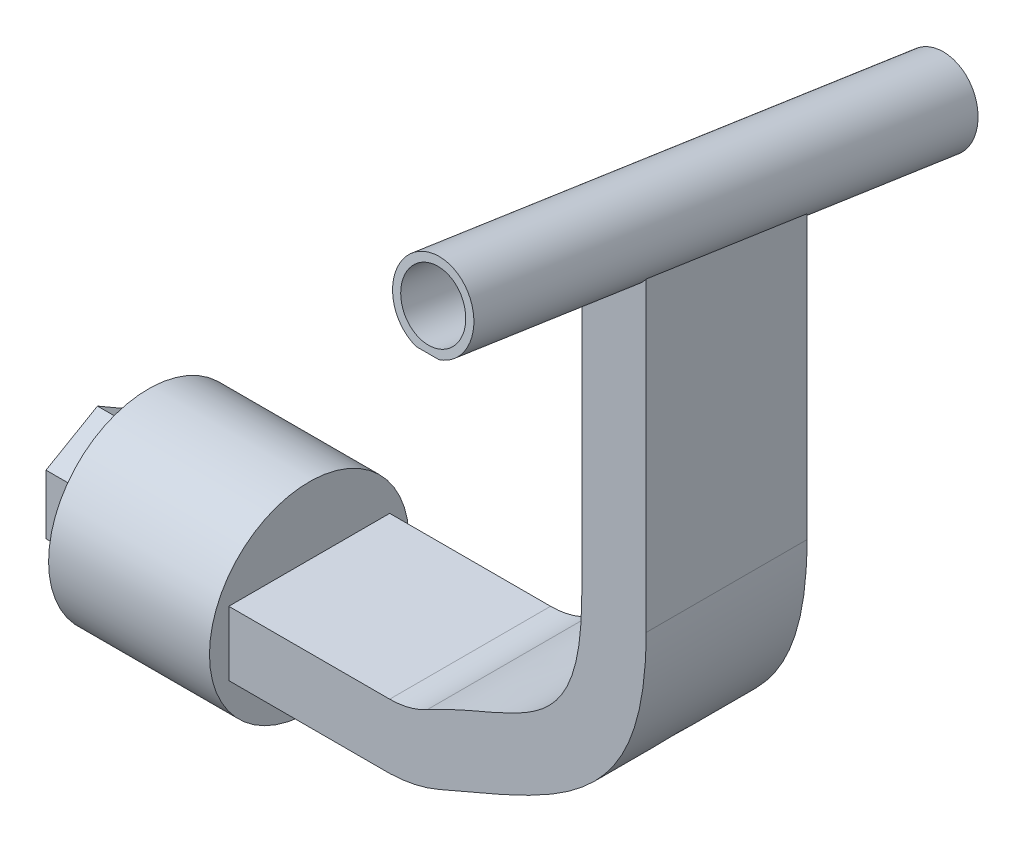
ISO-10303-21;
HEADER;
FILE_DESCRIPTION(('STEP AP214'),'2;1');
FILE_NAME('part.step','',(''),(''),'','','');
FILE_SCHEMA(('AUTOMOTIVE_DESIGN { 1 0 10303 214 1 1 1 1 }'));
ENDSEC;
DATA;
#1=APPLICATION_CONTEXT('core data for automotive mechanical design processes');
#2=APPLICATION_PROTOCOL_DEFINITION('international standard','automotive_design',2000,#1);
#3=PRODUCT_CONTEXT('',#1,'mechanical');
#4=PRODUCT('Part','Part','',(#3));
#5=PRODUCT_RELATED_PRODUCT_CATEGORY('part','',(#4));
#6=PRODUCT_DEFINITION_FORMATION('','',#4);
#7=PRODUCT_DEFINITION_CONTEXT('part definition',#1,'design');
#8=PRODUCT_DEFINITION('design','',#6,#7);
#9=PRODUCT_DEFINITION_SHAPE('','',#8);
#10=(LENGTH_UNIT() NAMED_UNIT(*) SI_UNIT(.MILLI.,.METRE.));
#11=(NAMED_UNIT(*) PLANE_ANGLE_UNIT() SI_UNIT($,.RADIAN.));
#12=(NAMED_UNIT(*) SI_UNIT($,.STERADIAN.) SOLID_ANGLE_UNIT());
#13=UNCERTAINTY_MEASURE_WITH_UNIT(LENGTH_MEASURE(1.E-05),#10,'distance_accuracy_value','');
#14=(GEOMETRIC_REPRESENTATION_CONTEXT(3) GLOBAL_UNCERTAINTY_ASSIGNED_CONTEXT((#13)) GLOBAL_UNIT_ASSIGNED_CONTEXT((#10,
#11,#12)) REPRESENTATION_CONTEXT('',''));
#15=CARTESIAN_POINT('',(0.,0.,0.));
#16=DIRECTION('',(0.,0.,1.));
#17=DIRECTION('',(1.,0.,0.));
#18=AXIS2_PLACEMENT_3D('',#15,#16,#17);
#19=CARTESIAN_POINT('',(303.883498747481,465.097462260105,173.034340632049));
#20=DIRECTION('',(0.,-0.146925308660243,-0.989147589429956));
#21=DIRECTION('',(0.,0.989147589429956,-0.146925308660243));
#22=AXIS2_PLACEMENT_3D('',#19,#20,#21);
#23=CYLINDRICAL_SURFACE('',#22,25.4);
#24=CARTESIAN_POINT('',(303.883498747481,479.428874282491,269.517933447575));
#25=DIRECTION('',(0.,-0.146925308660244,-0.989147589429956));
#26=DIRECTION('',(0.,0.989147589429956,-0.146925308660244));
#27=AXIS2_PLACEMENT_3D('',#24,#25,#26);
#28=CIRCLE('',#27,25.4);
#29=CARTESIAN_POINT('',(303.883498747481,504.553223054012,265.786030607604));
#30=VERTEX_POINT('',#29);
#31=EDGE_CURVE('E518',#30,#30,#28,.T.);
#32=ORIENTED_EDGE('',*,*,#31,.F.);
#33=EDGE_LOOP('',(#32));
#34=FACE_BOUND('',#33,.T.);
#35=CARTESIAN_POINT('',(303.883498747481,442.706045220284,22.2882480029235));
#36=DIRECTION('',(0.,-0.146925308660243,-0.989147589429956));
#37=DIRECTION('',(0.,0.989147589429956,-0.146925308660243));
#38=AXIS2_PLACEMENT_3D('',#35,#36,#37);
#39=CIRCLE('',#38,25.4);
#40=CARTESIAN_POINT('',(303.883498747481,467.830393991805,18.5563451629533));
#41=VERTEX_POINT('',#40);
#42=EDGE_CURVE('E11',#41,#41,#39,.F.);
#43=ORIENTED_EDGE('',*,*,#42,.F.);
#44=EDGE_LOOP('',(#43));
#45=FACE_BOUND('',#44,.T.);
#46=ADVANCED_FACE('F39',(#34,#45),#23,.F.);
#47=CARTESIAN_POINT('',(265.90949351965,390.165409654638,-123.979561218238));
#48=DIRECTION('',(0.,0.146925308660243,0.989147589429956));
#49=DIRECTION('',(0.,-0.989147589429956,0.146925308660243));
#50=AXIS2_PLACEMENT_3D('',#47,#48,#49);
#51=PLANE('',#50);
#52=CARTESIAN_POINT('',(303.883498747481,420.314628180463,-128.457844626202));
#53=DIRECTION('',(0.,-0.146925308660243,-0.989147589429956));
#54=DIRECTION('',(0.,0.989147589429956,-0.146925308660243));
#55=AXIS2_PLACEMENT_3D('',#52,#53,#54);
#56=CIRCLE('',#55,31.75);
#57=CARTESIAN_POINT('',(294.993498747482,390.165409654638,-123.979561218238));
#58=VERTEX_POINT('',#57);
#59=CARTESIAN_POINT('',(312.77349874748,390.165409654638,-123.979561218238));
#60=VERTEX_POINT('',#59);
#61=EDGE_CURVE('E179',#58,#60,#56,.T.);
#62=ORIENTED_EDGE('',*,*,#61,.T.);
#63=DIRECTION('',(1.,0.,0.));
#64=VECTOR('',#63,1.);
#65=CARTESIAN_POINT('',(265.90949351965,390.165409654638,-123.979561218238));
#66=LINE('',#65,#64);
#67=EDGE_CURVE('E195',#58,#60,#66,.T.);
#68=ORIENTED_EDGE('',*,*,#67,.F.);
#69=EDGE_LOOP('',(#62,#68));
#70=FACE_BOUND('',#69,.T.);
#71=ADVANCED_FACE('F202',(#70),#51,.F.);
#72=CARTESIAN_POINT('',(265.90949351965,390.165409654638,-123.979561218238));
#73=DIRECTION('',(0.,0.989147589429956,-0.146925308660243));
#74=DIRECTION('',(0.,0.146925308660243,0.989147589429956));
#75=AXIS2_PLACEMENT_3D('',#72,#73,#74);
#76=PLANE('',#75);
#77=DIRECTION('',(0.,-0.146925308660243,-0.989147589429956));
#78=VECTOR('',#77,1.);
#79=CARTESIAN_POINT('',(312.77349874748,450.892132371909,284.851918786842));
#80=LINE('',#79,#78);
#81=CARTESIAN_POINT('',(312.77349874748,449.279655756666,273.996216855539));
#82=VERTEX_POINT('',#81);
#83=CARTESIAN_POINT('',(312.77349874748,427.445235126035,127.));
#84=VERTEX_POINT('',#83);
#85=EDGE_CURVE('E213',#82,#84,#80,.T.);
#86=ORIENTED_EDGE('',*,*,#85,.F.);
#87=DIRECTION('',(1.,0.,0.));
#88=VECTOR('',#87,1.);
#89=CARTESIAN_POINT('',(265.90949351965,449.279655756666,273.996216855539));
#90=LINE('',#89,#88);
#91=CARTESIAN_POINT('',(294.993498747482,449.279655756666,273.996216855539));
#92=VERTEX_POINT('',#91);
#93=EDGE_CURVE('E205',#92,#82,#90,.T.);
#94=ORIENTED_EDGE('',*,*,#93,.F.);
#95=DIRECTION('',(0.,-0.146925308660243,-0.989147589429956));
#96=VECTOR('',#95,1.);
#97=CARTESIAN_POINT('',(294.993498747482,450.892132371909,284.851918786842));
#98=LINE('',#97,#96);
#99=CARTESIAN_POINT('',(294.993498747482,427.445235126035,127.));
#100=VERTEX_POINT('',#99);
#101=EDGE_CURVE('E200',#92,#100,#98,.T.);
#102=ORIENTED_EDGE('',*,*,#101,.T.);
#103=DIRECTION('',(-1.,0.,0.));
#104=VECTOR('',#103,1.);
#105=CARTESIAN_POINT('',(127.,427.445235126035,127.));
#106=LINE('',#105,#104);
#107=EDGE_CURVE('E204',#84,#100,#106,.T.);
#108=ORIENTED_EDGE('',*,*,#107,.F.);
#109=EDGE_LOOP('',(#86,#94,#102,#108));
#110=FACE_BOUND('',#109,.T.);
#111=ADVANCED_FACE('F334',(#110),#76,.F.);
#112=CARTESIAN_POINT('',(312.77349874748,408.580998485066,1.11022302462516E-13));
#113=VERTEX_POINT('',#112);
#114=EDGE_CURVE('E186',#113,#60,#80,.T.);
#115=ORIENTED_EDGE('',*,*,#114,.F.);
#116=DIRECTION('',(-1.,0.,0.));
#117=VECTOR('',#116,1.);
#118=CARTESIAN_POINT('',(127.,408.580998485066,0.));
#119=LINE('',#118,#117);
#120=CARTESIAN_POINT('',(294.993498747482,408.580998485066,1.11022302462516E-13));
#121=VERTEX_POINT('',#120);
#122=EDGE_CURVE('E197',#113,#121,#119,.T.);
#123=ORIENTED_EDGE('',*,*,#122,.T.);
#124=EDGE_CURVE('E183',#121,#58,#98,.T.);
#125=ORIENTED_EDGE('',*,*,#124,.T.);
#126=ORIENTED_EDGE('',*,*,#67,.T.);
#127=EDGE_LOOP('',(#115,#123,#125,#126));
#128=FACE_BOUND('',#127,.T.);
#129=ADVANCED_FACE('F194',(#128),#76,.F.);
#130=CARTESIAN_POINT('',(265.90949351965,449.279655756666,273.996216855539));
#131=DIRECTION('',(0.,-0.146925308660244,-0.989147589429956));
#132=DIRECTION('',(0.,0.989147589429956,-0.146925308660244));
#133=AXIS2_PLACEMENT_3D('',#130,#131,#132);
#134=PLANE('',#133);
#135=ORIENTED_EDGE('',*,*,#31,.T.);
#136=EDGE_LOOP('',(#135));
#137=FACE_BOUND('',#136,.T.);
#138=CARTESIAN_POINT('',(303.883498747481,479.428874282491,269.517933447575));
#139=DIRECTION('',(0.,-0.146925308660244,-0.989147589429956));
#140=DIRECTION('',(0.,0.989147589429956,-0.146925308660244));
#141=AXIS2_PLACEMENT_3D('',#138,#139,#140);
#142=CIRCLE('',#141,31.75);
#143=EDGE_CURVE('E48',#92,#82,#142,.T.);
#144=ORIENTED_EDGE('',*,*,#143,.F.);
#145=ORIENTED_EDGE('',*,*,#93,.T.);
#146=EDGE_LOOP('',(#144,#145));
#147=FACE_BOUND('',#146,.T.);
#148=ADVANCED_FACE('F344',(#137,#147),#134,.F.);
#149=CARTESIAN_POINT('',(329.40949351965,431.8,127.));
#150=DIRECTION('',(-1.,0.,0.));
#151=DIRECTION('',(0.,-1.,0.));
#152=AXIS2_PLACEMENT_3D('',#149,#150,#151);
#153=PLANE('',#152);
#154=DIRECTION('',(0.,1.,0.));
#155=VECTOR('',#154,1.);
#156=CARTESIAN_POINT('',(329.40949351965,431.8,0.));
#157=LINE('',#156,#155);
#158=CARTESIAN_POINT('',(329.40949351965,197.58169737665,0.));
#159=VERTEX_POINT('',#158);
#160=CARTESIAN_POINT('',(329.40949351965,420.307419163961,0.));
#161=VERTEX_POINT('',#160);
#162=EDGE_CURVE('E55',#159,#161,#157,.T.);
#163=ORIENTED_EDGE('',*,*,#162,.T.);
#164=DIRECTION('',(0.,-0.146925308660243,-0.989147589429956));
#165=VECTOR('',#164,1.);
#166=CARTESIAN_POINT('',(329.40949351965,462.365414264384,283.147708513865));
#167=LINE('',#166,#165);
#168=CARTESIAN_POINT('',(329.40949351965,439.17165580493,127.));
#169=VERTEX_POINT('',#168);
#170=EDGE_CURVE('E506',#169,#161,#167,.T.);
#171=ORIENTED_EDGE('',*,*,#170,.F.);
#172=DIRECTION('',(0.,1.,0.));
#173=VECTOR('',#172,1.);
#174=CARTESIAN_POINT('',(329.40949351965,431.8,127.));
#175=LINE('',#174,#173);
#176=CARTESIAN_POINT('',(329.40949351965,197.58169737665,127.));
#177=VERTEX_POINT('',#176);
#178=EDGE_CURVE('E63',#177,#169,#175,.T.);
#179=ORIENTED_EDGE('',*,*,#178,.F.);
#180=DIRECTION('',(0.,0.,-1.));
#181=VECTOR('',#180,1.);
#182=CARTESIAN_POINT('',(329.40949351965,197.58169737665,127.));
#183=LINE('',#182,#181);
#184=EDGE_CURVE('E476',#177,#159,#183,.T.);
#185=ORIENTED_EDGE('',*,*,#184,.T.);
#186=EDGE_LOOP('',(#163,#171,#179,#185));
#187=FACE_BOUND('',#186,.T.);
#188=ADVANCED_FACE('F319',(#187),#153,.F.);
#189=CARTESIAN_POINT('',(278.60949351965,197.58169737665,127.));
#190=DIRECTION('',(1.,0.,0.));
#191=DIRECTION('',(0.,0.,-1.));
#192=AXIS2_PLACEMENT_3D('',#189,#190,#191);
#193=PLANE('',#192);
#194=DIRECTION('',(0.,0.,-1.));
#195=VECTOR('',#194,1.);
#196=CARTESIAN_POINT('',(278.60949351965,197.58169737665,127.));
#197=LINE('',#196,#195);
#198=CARTESIAN_POINT('',(278.60949351965,197.58169737665,127.));
#199=VERTEX_POINT('',#198);
#200=CARTESIAN_POINT('',(278.60949351965,197.58169737665,0.));
#201=VERTEX_POINT('',#200);
#202=EDGE_CURVE('E472',#199,#201,#197,.T.);
#203=ORIENTED_EDGE('',*,*,#202,.F.);
#204=DIRECTION('',(0.,-1.,0.));
#205=VECTOR('',#204,1.);
#206=CARTESIAN_POINT('',(278.60949351965,197.58169737665,127.));
#207=LINE('',#206,#205);
#208=CARTESIAN_POINT('',(278.60949351965,438.831962842002,127.));
#209=VERTEX_POINT('',#208);
#210=EDGE_CURVE('E415',#209,#199,#207,.T.);
#211=ORIENTED_EDGE('',*,*,#210,.F.);
#212=DIRECTION('',(0.,-0.146925308660243,-0.989147589429956));
#213=VECTOR('',#212,1.);
#214=CARTESIAN_POINT('',(278.60949351965,462.033054269183,283.197076368978));
#215=LINE('',#214,#213);
#216=CARTESIAN_POINT('',(278.60949351965,419.967726201033,0.));
#217=VERTEX_POINT('',#216);
#218=EDGE_CURVE('E191',#209,#217,#215,.T.);
#219=ORIENTED_EDGE('',*,*,#218,.T.);
#220=DIRECTION('',(0.,-1.,0.));
#221=VECTOR('',#220,1.);
#222=CARTESIAN_POINT('',(278.60949351965,197.58169737665,0.));
#223=LINE('',#222,#221);
#224=EDGE_CURVE('E444',#217,#201,#223,.T.);
#225=ORIENTED_EDGE('',*,*,#224,.T.);
#226=EDGE_LOOP('',(#203,#211,#219,#225));
#227=FACE_BOUND('',#226,.T.);
#228=ADVANCED_FACE('F394',(#227),#193,.F.);
#229=CARTESIAN_POINT('',(127.,112.157410594799,127.));
#230=DIRECTION('',(0.,0.,1.));
#231=DIRECTION('',(1.,0.,0.));
#232=AXIS2_PLACEMENT_3D('',#229,#230,#231);
#233=PLANE('',#232);
#234=ORIENTED_EDGE('',*,*,#178,.T.);
#235=CARTESIAN_POINT('',(303.883498747481,458.259645761728,127.));
#236=DIRECTION('',(0.,0.,1.));
#237=DIRECTION('',(0.,-1.,0.));
#238=AXIS2_PLACEMENT_3D('',#235,#236,#237);
#239=ELLIPSE('',#238,32.0983444121797,31.75);
#240=EDGE_CURVE('E515',#169,#84,#239,.F.);
#241=ORIENTED_EDGE('',*,*,#240,.T.);
#242=ORIENTED_EDGE('',*,*,#107,.T.);
#243=EDGE_CURVE('E514',#100,#209,#239,.F.);
#244=ORIENTED_EDGE('',*,*,#243,.T.);
#245=ORIENTED_EDGE('',*,*,#210,.T.);
#246=CARTESIAN_POINT('',(278.60949351965,197.58169737665,127.));
#247=CARTESIAN_POINT('',(278.60949351965,141.969854777036,127.));
#248=CARTESIAN_POINT('',(253.765909659463,94.0189960509211,127.));
#249=CARTESIAN_POINT('',(189.028044030552,76.2956447531783,127.));
#250=CARTESIAN_POINT('',(156.630652755223,58.4288683458401,127.));
#251=B_SPLINE_CURVE_WITH_KNOTS('',3,(#246,#247,#248,#249,#250),.UNSPECIFIED.,.F.,.F.,(4,1,4),
(0.,0.524889868786519,1.),.UNSPECIFIED.);
#252=CARTESIAN_POINT('',(156.630652755223,58.4288683458401,127.));
#253=VERTEX_POINT('',#252);
#254=EDGE_CURVE('E408',#199,#253,#251,.T.);
#255=ORIENTED_EDGE('',*,*,#254,.T.);
#256=CARTESIAN_POINT('',(127.,112.157410594799,127.));
#257=DIRECTION('',(0.,0.,-1.));
#258=DIRECTION('',(1.,0.,0.));
#259=AXIS2_PLACEMENT_3D('',#256,#257,#258);
#260=CIRCLE('',#259,61.3574105947991);
#261=CARTESIAN_POINT('',(127.,50.8,127.));
#262=VERTEX_POINT('',#261);
#263=EDGE_CURVE('E414',#253,#262,#260,.T.);
#264=ORIENTED_EDGE('',*,*,#263,.T.);
#265=DIRECTION('',(-1.,0.,0.));
#266=VECTOR('',#265,1.);
#267=CARTESIAN_POINT('',(0.,50.8,127.));
#268=LINE('',#267,#266);
#269=CARTESIAN_POINT('',(0.,50.8,127.));
#270=VERTEX_POINT('',#269);
#271=EDGE_CURVE('E421',#262,#270,#268,.T.);
#272=ORIENTED_EDGE('',*,*,#271,.T.);
#273=DIRECTION('',(0.,-1.,0.));
#274=VECTOR('',#273,1.);
#275=CARTESIAN_POINT('',(0.,0.,127.));
#276=LINE('',#275,#274);
#277=CARTESIAN_POINT('',(0.,0.,127.));
#278=VERTEX_POINT('',#277);
#279=EDGE_CURVE('E291',#270,#278,#276,.T.);
#280=ORIENTED_EDGE('',*,*,#279,.T.);
#281=DIRECTION('',(1.,0.,0.));
#282=VECTOR('',#281,1.);
#283=CARTESIAN_POINT('',(0.,0.,127.));
#284=LINE('',#283,#282);
#285=CARTESIAN_POINT('',(127.,0.,127.));
#286=VERTEX_POINT('',#285);
#287=EDGE_CURVE('E295',#278,#286,#284,.T.);
#288=ORIENTED_EDGE('',*,*,#287,.T.);
#289=CARTESIAN_POINT('',(124.298891171521,105.453320242857,127.));
#290=DIRECTION('',(0.,0.,1.));
#291=DIRECTION('',(-1.,0.,0.));
#292=AXIS2_PLACEMENT_3D('',#289,#290,#291);
#293=CIRCLE('',#292,105.487908023365);
#294=CARTESIAN_POINT('',(165.763803889194,8.45662054404478,127.));
#295=VERTEX_POINT('',#294);
#296=EDGE_CURVE('E299',#286,#295,#293,.T.);
#297=ORIENTED_EDGE('',*,*,#296,.T.);
#298=CARTESIAN_POINT('',(165.763803889194,8.45662054404477,127.));
#299=CARTESIAN_POINT('',(215.950754250224,29.9109331417734,127.));
#300=CARTESIAN_POINT('',(293.749967936067,60.0247960495449,127.));
#301=CARTESIAN_POINT('',(329.40949351965,131.409080946919,127.));
#302=CARTESIAN_POINT('',(329.40949351965,197.58169737665,127.));
#303=B_SPLINE_CURVE_WITH_KNOTS('',3,(#298,#299,#300,#301,#302),.UNSPECIFIED.,.F.,.F.,(4,1,4),
(0.,0.489737157637003,1.),.UNSPECIFIED.);
#304=EDGE_CURVE('E302',#295,#177,#303,.T.);
#305=ORIENTED_EDGE('',*,*,#304,.T.);
#306=EDGE_LOOP('',(#234,#241,#242,#244,#245,#255,#264,#272,#280,#288,#297,#305));
#307=FACE_BOUND('',#306,.T.);
#308=ADVANCED_FACE('F391',(#307),#233,.T.);
#309=CARTESIAN_POINT('',(127.,112.157410594799,0.));
#310=DIRECTION('',(0.,0.,1.));
#311=DIRECTION('',(1.,0.,0.));
#312=AXIS2_PLACEMENT_3D('',#309,#310,#311);
#313=PLANE('',#312);
#314=CARTESIAN_POINT('',(278.60949351965,197.58169737665,0.));
#315=CARTESIAN_POINT('',(278.60949351965,141.969854777036,0.));
#316=CARTESIAN_POINT('',(253.765909659463,94.0189960509211,0.));
#317=CARTESIAN_POINT('',(189.028044030552,76.2956447531783,0.));
#318=CARTESIAN_POINT('',(156.630652755223,58.4288683458401,0.));
#319=B_SPLINE_CURVE_WITH_KNOTS('',3,(#314,#315,#316,#317,#318),.UNSPECIFIED.,.F.,.F.,(4,1,4),
(0.,0.524889868786519,1.),.UNSPECIFIED.);
#320=CARTESIAN_POINT('',(156.630652755223,58.4288683458401,0.));
#321=VERTEX_POINT('',#320);
#322=EDGE_CURVE('E447',#201,#321,#319,.T.);
#323=ORIENTED_EDGE('',*,*,#322,.F.);
#324=ORIENTED_EDGE('',*,*,#224,.F.);
#325=CARTESIAN_POINT('',(303.883498747481,439.395409120758,0.));
#326=DIRECTION('',(0.,0.,-1.));
#327=DIRECTION('',(0.,-1.,0.));
#328=AXIS2_PLACEMENT_3D('',#325,#326,#327);
#329=ELLIPSE('',#328,32.0983444121797,31.75);
#330=EDGE_CURVE('E509',#217,#121,#329,.F.);
#331=ORIENTED_EDGE('',*,*,#330,.T.);
#332=ORIENTED_EDGE('',*,*,#122,.F.);
#333=EDGE_CURVE('E510',#113,#161,#329,.F.);
#334=ORIENTED_EDGE('',*,*,#333,.T.);
#335=ORIENTED_EDGE('',*,*,#162,.F.);
#336=CARTESIAN_POINT('',(165.763803889194,8.45662054404477,0.));
#337=CARTESIAN_POINT('',(215.950754250224,29.9109331417734,0.));
#338=CARTESIAN_POINT('',(293.749967936067,60.0247960495449,0.));
#339=CARTESIAN_POINT('',(329.40949351965,131.409080946919,0.));
#340=CARTESIAN_POINT('',(329.40949351965,197.58169737665,0.));
#341=B_SPLINE_CURVE_WITH_KNOTS('',3,(#336,#337,#338,#339,#340),.UNSPECIFIED.,.F.,.F.,(4,1,4),
(0.,0.489737157637003,1.),.UNSPECIFIED.);
#342=CARTESIAN_POINT('',(165.763803889194,8.45662054404478,0.));
#343=VERTEX_POINT('',#342);
#344=EDGE_CURVE('E434',#343,#159,#341,.T.);
#345=ORIENTED_EDGE('',*,*,#344,.F.);
#346=CARTESIAN_POINT('',(124.298891171521,105.453320242857,0.));
#347=DIRECTION('',(0.,0.,1.));
#348=DIRECTION('',(-1.,0.,0.));
#349=AXIS2_PLACEMENT_3D('',#346,#347,#348);
#350=CIRCLE('',#349,105.487908023365);
#351=CARTESIAN_POINT('',(127.,0.,0.));
#352=VERTEX_POINT('',#351);
#353=EDGE_CURVE('E431',#352,#343,#350,.T.);
#354=ORIENTED_EDGE('',*,*,#353,.F.);
#355=DIRECTION('',(1.,0.,0.));
#356=VECTOR('',#355,1.);
#357=CARTESIAN_POINT('',(0.,0.,0.));
#358=LINE('',#357,#356);
#359=CARTESIAN_POINT('',(0.,0.,0.));
#360=VERTEX_POINT('',#359);
#361=EDGE_CURVE('E428',#360,#352,#358,.T.);
#362=ORIENTED_EDGE('',*,*,#361,.F.);
#363=DIRECTION('',(0.,-1.,0.));
#364=VECTOR('',#363,1.);
#365=CARTESIAN_POINT('',(0.,0.,0.));
#366=LINE('',#365,#364);
#367=CARTESIAN_POINT('',(0.,50.8,0.));
#368=VERTEX_POINT('',#367);
#369=EDGE_CURVE('E287',#368,#360,#366,.T.);
#370=ORIENTED_EDGE('',*,*,#369,.F.);
#371=DIRECTION('',(-1.,0.,0.));
#372=VECTOR('',#371,1.);
#373=CARTESIAN_POINT('',(0.,50.8,0.));
#374=LINE('',#373,#372);
#375=CARTESIAN_POINT('',(127.,50.8,0.));
#376=VERTEX_POINT('',#375);
#377=EDGE_CURVE('E296',#376,#368,#374,.T.);
#378=ORIENTED_EDGE('',*,*,#377,.F.);
#379=CARTESIAN_POINT('',(127.,112.157410594799,0.));
#380=DIRECTION('',(0.,0.,-1.));
#381=DIRECTION('',(1.,0.,0.));
#382=AXIS2_PLACEMENT_3D('',#379,#380,#381);
#383=CIRCLE('',#382,61.3574105947991);
#384=EDGE_CURVE('E452',#321,#376,#383,.T.);
#385=ORIENTED_EDGE('',*,*,#384,.F.);
#386=EDGE_LOOP('',(#323,#324,#331,#332,#334,#335,#345,#354,#362,#370,#378,#385));
#387=FACE_BOUND('',#386,.T.);
#388=ADVANCED_FACE('F326',(#387),#313,.F.);
#389=CARTESIAN_POINT('',(0.,0.,127.));
#390=DIRECTION('',(0.,1.,0.));
#391=DIRECTION('',(0.,0.,1.));
#392=AXIS2_PLACEMENT_3D('',#389,#390,#391);
#393=PLANE('',#392);
#394=ORIENTED_EDGE('',*,*,#361,.T.);
#395=DIRECTION('',(0.,0.,-1.));
#396=VECTOR('',#395,1.);
#397=CARTESIAN_POINT('',(127.,0.,127.));
#398=LINE('',#397,#396);
#399=EDGE_CURVE('E483',#286,#352,#398,.T.);
#400=ORIENTED_EDGE('',*,*,#399,.F.);
#401=ORIENTED_EDGE('',*,*,#287,.F.);
#402=DIRECTION('',(0.,0.,-1.));
#403=VECTOR('',#402,1.);
#404=CARTESIAN_POINT('',(0.,0.,127.));
#405=LINE('',#404,#403);
#406=EDGE_CURVE('E487',#278,#360,#405,.T.);
#407=ORIENTED_EDGE('',*,*,#406,.T.);
#408=EDGE_LOOP('',(#394,#400,#401,#407));
#409=FACE_BOUND('',#408,.T.);
#410=ADVANCED_FACE('F41',(#409),#393,.F.);
#411=CARTESIAN_POINT('',(124.298891171521,105.453320242857,127.));
#412=DIRECTION('',(0.,0.,-1.));
#413=DIRECTION('',(-1.,0.,0.));
#414=AXIS2_PLACEMENT_3D('',#411,#412,#413);
#415=CYLINDRICAL_SURFACE('',#414,105.487908023365);
#416=ORIENTED_EDGE('',*,*,#353,.T.);
#417=DIRECTION('',(0.,0.,-1.));
#418=VECTOR('',#417,1.);
#419=CARTESIAN_POINT('',(165.763803889194,8.45662054404478,127.));
#420=LINE('',#419,#418);
#421=EDGE_CURVE('E479',#295,#343,#420,.T.);
#422=ORIENTED_EDGE('',*,*,#421,.F.);
#423=ORIENTED_EDGE('',*,*,#296,.F.);
#424=ORIENTED_EDGE('',*,*,#399,.T.);
#425=EDGE_LOOP('',(#416,#422,#423,#424));
#426=FACE_BOUND('',#425,.T.);
#427=ADVANCED_FACE('F317',(#426),#415,.T.);
#428=DIRECTION('',(0.,0.,-1.));
#429=VECTOR('',#428,1.);
#430=SURFACE_OF_LINEAR_EXTRUSION('',#303,#429);
#431=ORIENTED_EDGE('',*,*,#344,.T.);
#432=ORIENTED_EDGE('',*,*,#184,.F.);
#433=ORIENTED_EDGE('',*,*,#304,.F.);
#434=ORIENTED_EDGE('',*,*,#421,.T.);
#435=EDGE_LOOP('',(#431,#432,#433,#434));
#436=FACE_BOUND('',#435,.T.);
#437=ADVANCED_FACE('F313',(#436),#430,.F.);
#438=DIRECTION('',(0.,0.,-1.));
#439=VECTOR('',#438,1.);
#440=SURFACE_OF_LINEAR_EXTRUSION('',#251,#439);
#441=ORIENTED_EDGE('',*,*,#322,.T.);
#442=DIRECTION('',(0.,0.,-1.));
#443=VECTOR('',#442,1.);
#444=CARTESIAN_POINT('',(156.630652755223,58.4288683458401,127.));
#445=LINE('',#444,#443);
#446=EDGE_CURVE('E468',#253,#321,#445,.T.);
#447=ORIENTED_EDGE('',*,*,#446,.F.);
#448=ORIENTED_EDGE('',*,*,#254,.F.);
#449=ORIENTED_EDGE('',*,*,#202,.T.);
#450=EDGE_LOOP('',(#441,#447,#448,#449));
#451=FACE_BOUND('',#450,.T.);
#452=ADVANCED_FACE('F316',(#451),#440,.F.);
#453=CARTESIAN_POINT('',(127.,112.157410594799,127.));
#454=DIRECTION('',(0.,0.,-1.));
#455=DIRECTION('',(-1.,0.,0.));
#456=AXIS2_PLACEMENT_3D('',#453,#454,#455);
#457=CYLINDRICAL_SURFACE('',#456,61.3574105947991);
#458=ORIENTED_EDGE('',*,*,#384,.T.);
#459=DIRECTION('',(0.,0.,-1.));
#460=VECTOR('',#459,1.);
#461=CARTESIAN_POINT('',(127.,50.8,127.));
#462=LINE('',#461,#460);
#463=EDGE_CURVE('E464',#262,#376,#462,.T.);
#464=ORIENTED_EDGE('',*,*,#463,.F.);
#465=ORIENTED_EDGE('',*,*,#263,.F.);
#466=ORIENTED_EDGE('',*,*,#446,.T.);
#467=EDGE_LOOP('',(#458,#464,#465,#466));
#468=FACE_BOUND('',#467,.T.);
#469=ADVANCED_FACE('F400',(#468),#457,.F.);
#470=CARTESIAN_POINT('',(0.,50.8,127.));
#471=DIRECTION('',(0.,-1.,0.));
#472=DIRECTION('',(1.,0.,0.));
#473=AXIS2_PLACEMENT_3D('',#470,#471,#472);
#474=PLANE('',#473);
#475=ORIENTED_EDGE('',*,*,#377,.T.);
#476=DIRECTION('',(0.,0.,-1.));
#477=VECTOR('',#476,1.);
#478=CARTESIAN_POINT('',(0.,50.8,127.));
#479=LINE('',#478,#477);
#480=EDGE_CURVE('E424',#270,#368,#479,.T.);
#481=ORIENTED_EDGE('',*,*,#480,.F.);
#482=ORIENTED_EDGE('',*,*,#271,.F.);
#483=ORIENTED_EDGE('',*,*,#463,.T.);
#484=EDGE_LOOP('',(#475,#481,#482,#483));
#485=FACE_BOUND('',#484,.T.);
#486=ADVANCED_FACE('F386',(#485),#474,.F.);
#487=CARTESIAN_POINT('',(0.,25.4,63.5));
#488=DIRECTION('',(-1.,0.,0.));
#489=DIRECTION('',(0.,0.,1.));
#490=AXIS2_PLACEMENT_3D('',#487,#488,#489);
#491=PLANE('',#490);
#492=CARTESIAN_POINT('',(0.,25.4,63.5));
#493=DIRECTION('',(-1.,0.,0.));
#494=DIRECTION('',(0.,0.,1.));
#495=AXIS2_PLACEMENT_3D('',#492,#493,#494);
#496=CIRCLE('',#495,78.74);
#497=CARTESIAN_POINT('',(0.,25.4,142.24));
#498=VERTEX_POINT('',#497);
#499=EDGE_CURVE('E282',#498,#498,#496,.T.);
#500=ORIENTED_EDGE('',*,*,#499,.F.);
#501=EDGE_LOOP('',(#500));
#502=FACE_BOUND('',#501,.T.);
#503=ORIENTED_EDGE('',*,*,#480,.T.);
#504=ORIENTED_EDGE('',*,*,#369,.T.);
#505=ORIENTED_EDGE('',*,*,#406,.F.);
#506=ORIENTED_EDGE('',*,*,#279,.F.);
#507=EDGE_LOOP('',(#503,#504,#505,#506));
#508=FACE_BOUND('',#507,.T.);
#509=ADVANCED_FACE('F383',(#502,#508),#491,.F.);
#510=CARTESIAN_POINT('',(-127.,25.4,63.5));
#511=DIRECTION('',(1.,0.,0.));
#512=DIRECTION('',(0.,0.,-1.));
#513=AXIS2_PLACEMENT_3D('',#510,#511,#512);
#514=CYLINDRICAL_SURFACE('',#513,78.74);
#515=CARTESIAN_POINT('',(-127.,25.4,63.5));
#516=DIRECTION('',(-1.,0.,0.));
#517=DIRECTION('',(0.,0.,1.));
#518=AXIS2_PLACEMENT_3D('',#515,#516,#517);
#519=CIRCLE('',#518,78.74);
#520=CARTESIAN_POINT('',(-127.,25.4,142.24));
#521=VERTEX_POINT('',#520);
#522=EDGE_CURVE('E283',#521,#521,#519,.T.);
#523=ORIENTED_EDGE('',*,*,#522,.F.);
#524=EDGE_LOOP('',(#523));
#525=FACE_BOUND('',#524,.T.);
#526=ORIENTED_EDGE('',*,*,#499,.T.);
#527=EDGE_LOOP('',(#526));
#528=FACE_BOUND('',#527,.T.);
#529=ADVANCED_FACE('F381',(#525,#528),#514,.T.);
#530=CARTESIAN_POINT('',(-127.,25.4,63.5));
#531=DIRECTION('',(-1.,0.,0.));
#532=DIRECTION('',(0.,0.,1.));
#533=AXIS2_PLACEMENT_3D('',#530,#531,#532);
#534=PLANE('',#533);
#535=DIRECTION('',(0.,0.5,-0.866025403784439));
#536=VECTOR('',#535,1.);
#537=CARTESIAN_POINT('',(-127.,48.8635149398664,104.14));
#538=LINE('',#537,#536);
#539=CARTESIAN_POINT('',(-127.,48.8635149398664,104.14));
#540=VERTEX_POINT('',#539);
#541=CARTESIAN_POINT('',(-127.,72.3270298797328,63.5));
#542=VERTEX_POINT('',#541);
#543=EDGE_CURVE('E210',#540,#542,#538,.T.);
#544=ORIENTED_EDGE('',*,*,#543,.F.);
#545=DIRECTION('',(0.,1.,0.));
#546=VECTOR('',#545,1.);
#547=CARTESIAN_POINT('',(-127.,1.93648506013358,104.14));
#548=LINE('',#547,#546);
#549=CARTESIAN_POINT('',(-127.,1.93648506013358,104.14));
#550=VERTEX_POINT('',#549);
#551=EDGE_CURVE('E221',#550,#540,#548,.T.);
#552=ORIENTED_EDGE('',*,*,#551,.F.);
#553=DIRECTION('',(0.,0.5,0.866025403784439));
#554=VECTOR('',#553,1.);
#555=CARTESIAN_POINT('',(-127.,-21.5270298797328,63.5));
#556=LINE('',#555,#554);
#557=CARTESIAN_POINT('',(-127.,-21.5270298797328,63.5));
#558=VERTEX_POINT('',#557);
#559=EDGE_CURVE('E252',#558,#550,#556,.T.);
#560=ORIENTED_EDGE('',*,*,#559,.F.);
#561=DIRECTION('',(0.,-0.5,0.866025403784439));
#562=VECTOR('',#561,1.);
#563=CARTESIAN_POINT('',(-127.,1.93648506013359,22.86));
#564=LINE('',#563,#562);
#565=CARTESIAN_POINT('',(-127.,1.93648506013359,22.86));
#566=VERTEX_POINT('',#565);
#567=EDGE_CURVE('E248',#566,#558,#564,.T.);
#568=ORIENTED_EDGE('',*,*,#567,.F.);
#569=DIRECTION('',(0.,-1.,0.));
#570=VECTOR('',#569,1.);
#571=CARTESIAN_POINT('',(-127.,48.8635149398664,22.86));
#572=LINE('',#571,#570);
#573=CARTESIAN_POINT('',(-127.,48.8635149398664,22.86));
#574=VERTEX_POINT('',#573);
#575=EDGE_CURVE('E244',#574,#566,#572,.T.);
#576=ORIENTED_EDGE('',*,*,#575,.F.);
#577=DIRECTION('',(0.,-0.5,-0.866025403784439));
#578=VECTOR('',#577,1.);
#579=CARTESIAN_POINT('',(-127.,72.3270298797328,63.5));
#580=LINE('',#579,#578);
#581=EDGE_CURVE('E240',#542,#574,#580,.T.);
#582=ORIENTED_EDGE('',*,*,#581,.F.);
#583=EDGE_LOOP('',(#544,#552,#560,#568,#576,#582));
#584=FACE_BOUND('',#583,.T.);
#585=ORIENTED_EDGE('',*,*,#522,.T.);
#586=EDGE_LOOP('',(#585));
#587=FACE_BOUND('',#586,.T.);
#588=ADVANCED_FACE('F377',(#584,#587),#534,.T.);
#589=CARTESIAN_POINT('',(-167.132,48.8635149398664,104.14));
#590=DIRECTION('',(0.,-0.866025403784439,-0.5));
#591=DIRECTION('',(0.,0.5,-0.866025403784439));
#592=AXIS2_PLACEMENT_3D('',#589,#590,#591);
#593=PLANE('',#592);
#594=ORIENTED_EDGE('',*,*,#543,.T.);
#595=DIRECTION('',(1.,0.,0.));
#596=VECTOR('',#595,1.);
#597=CARTESIAN_POINT('',(-167.132,72.3270298797328,63.5));
#598=LINE('',#597,#596);
#599=CARTESIAN_POINT('',(-167.132,72.3270298797328,63.5));
#600=VERTEX_POINT('',#599);
#601=EDGE_CURVE('E278',#600,#542,#598,.T.);
#602=ORIENTED_EDGE('',*,*,#601,.F.);
#603=DIRECTION('',(0.,0.5,-0.866025403784439));
#604=VECTOR('',#603,1.);
#605=CARTESIAN_POINT('',(-167.132,48.8635149398664,104.14));
#606=LINE('',#605,#604);
#607=CARTESIAN_POINT('',(-167.132,48.8635149398664,104.14));
#608=VERTEX_POINT('',#607);
#609=EDGE_CURVE('E216',#608,#600,#606,.T.);
#610=ORIENTED_EDGE('',*,*,#609,.F.);
#611=DIRECTION('',(1.,0.,0.));
#612=VECTOR('',#611,1.);
#613=CARTESIAN_POINT('',(-167.132,48.8635149398664,104.14));
#614=LINE('',#613,#612);
#615=EDGE_CURVE('E236',#608,#540,#614,.T.);
#616=ORIENTED_EDGE('',*,*,#615,.T.);
#617=EDGE_LOOP('',(#594,#602,#610,#616));
#618=FACE_BOUND('',#617,.T.);
#619=ADVANCED_FACE('F373',(#618),#593,.F.);
#620=CARTESIAN_POINT('',(-167.132,72.3270298797328,63.5));
#621=DIRECTION('',(0.,-0.866025403784439,0.5));
#622=DIRECTION('',(0.,-0.5,-0.866025403784439));
#623=AXIS2_PLACEMENT_3D('',#620,#621,#622);
#624=PLANE('',#623);
#625=ORIENTED_EDGE('',*,*,#581,.T.);
#626=DIRECTION('',(1.,0.,0.));
#627=VECTOR('',#626,1.);
#628=CARTESIAN_POINT('',(-167.132,48.8635149398664,22.86));
#629=LINE('',#628,#627);
#630=CARTESIAN_POINT('',(-167.132,48.8635149398664,22.86));
#631=VERTEX_POINT('',#630);
#632=EDGE_CURVE('E274',#631,#574,#629,.T.);
#633=ORIENTED_EDGE('',*,*,#632,.F.);
#634=DIRECTION('',(0.,-0.5,-0.866025403784439));
#635=VECTOR('',#634,1.);
#636=CARTESIAN_POINT('',(-167.132,72.3270298797328,63.5));
#637=LINE('',#636,#635);
#638=EDGE_CURVE('E220',#600,#631,#637,.T.);
#639=ORIENTED_EDGE('',*,*,#638,.F.);
#640=ORIENTED_EDGE('',*,*,#601,.T.);
#641=EDGE_LOOP('',(#625,#633,#639,#640));
#642=FACE_BOUND('',#641,.T.);
#643=ADVANCED_FACE('F369',(#642),#624,.F.);
#644=CARTESIAN_POINT('',(-167.132,48.8635149398664,22.86));
#645=DIRECTION('',(0.,0.,1.));
#646=DIRECTION('',(0.,-1.,0.));
#647=AXIS2_PLACEMENT_3D('',#644,#645,#646);
#648=PLANE('',#647);
#649=ORIENTED_EDGE('',*,*,#575,.T.);
#650=DIRECTION('',(1.,0.,0.));
#651=VECTOR('',#650,1.);
#652=CARTESIAN_POINT('',(-167.132,1.93648506013359,22.86));
#653=LINE('',#652,#651);
#654=CARTESIAN_POINT('',(-167.132,1.93648506013359,22.86));
#655=VERTEX_POINT('',#654);
#656=EDGE_CURVE('E270',#655,#566,#653,.T.);
#657=ORIENTED_EDGE('',*,*,#656,.F.);
#658=DIRECTION('',(0.,-1.,0.));
#659=VECTOR('',#658,1.);
#660=CARTESIAN_POINT('',(-167.132,48.8635149398664,22.86));
#661=LINE('',#660,#659);
#662=EDGE_CURVE('E224',#631,#655,#661,.T.);
#663=ORIENTED_EDGE('',*,*,#662,.F.);
#664=ORIENTED_EDGE('',*,*,#632,.T.);
#665=EDGE_LOOP('',(#649,#657,#663,#664));
#666=FACE_BOUND('',#665,.T.);
#667=ADVANCED_FACE('F365',(#666),#648,.F.);
#668=CARTESIAN_POINT('',(-167.132,1.93648506013359,22.86));
#669=DIRECTION('',(0.,0.866025403784439,0.5));
#670=DIRECTION('',(0.,-0.5,0.866025403784439));
#671=AXIS2_PLACEMENT_3D('',#668,#669,#670);
#672=PLANE('',#671);
#673=ORIENTED_EDGE('',*,*,#567,.T.);
#674=DIRECTION('',(1.,0.,0.));
#675=VECTOR('',#674,1.);
#676=CARTESIAN_POINT('',(-167.132,-21.5270298797328,63.5));
#677=LINE('',#676,#675);
#678=CARTESIAN_POINT('',(-167.132,-21.5270298797328,63.5));
#679=VERTEX_POINT('',#678);
#680=EDGE_CURVE('E266',#679,#558,#677,.T.);
#681=ORIENTED_EDGE('',*,*,#680,.F.);
#682=DIRECTION('',(0.,-0.5,0.866025403784439));
#683=VECTOR('',#682,1.);
#684=CARTESIAN_POINT('',(-167.132,1.93648506013359,22.86));
#685=LINE('',#684,#683);
#686=EDGE_CURVE('E227',#655,#679,#685,.T.);
#687=ORIENTED_EDGE('',*,*,#686,.F.);
#688=ORIENTED_EDGE('',*,*,#656,.T.);
#689=EDGE_LOOP('',(#673,#681,#687,#688));
#690=FACE_BOUND('',#689,.T.);
#691=ADVANCED_FACE('F361',(#690),#672,.F.);
#692=CARTESIAN_POINT('',(-167.132,-21.5270298797328,63.5));
#693=DIRECTION('',(0.,0.866025403784439,-0.5));
#694=DIRECTION('',(0.,0.5,0.866025403784439));
#695=AXIS2_PLACEMENT_3D('',#692,#693,#694);
#696=PLANE('',#695);
#697=ORIENTED_EDGE('',*,*,#559,.T.);
#698=DIRECTION('',(1.,0.,0.));
#699=VECTOR('',#698,1.);
#700=CARTESIAN_POINT('',(-167.132,1.93648506013358,104.14));
#701=LINE('',#700,#699);
#702=CARTESIAN_POINT('',(-167.132,1.93648506013358,104.14));
#703=VERTEX_POINT('',#702);
#704=EDGE_CURVE('E262',#703,#550,#701,.T.);
#705=ORIENTED_EDGE('',*,*,#704,.F.);
#706=DIRECTION('',(0.,0.5,0.866025403784439));
#707=VECTOR('',#706,1.);
#708=CARTESIAN_POINT('',(-167.132,-21.5270298797328,63.5));
#709=LINE('',#708,#707);
#710=EDGE_CURVE('E230',#679,#703,#709,.T.);
#711=ORIENTED_EDGE('',*,*,#710,.F.);
#712=ORIENTED_EDGE('',*,*,#680,.T.);
#713=EDGE_LOOP('',(#697,#705,#711,#712));
#714=FACE_BOUND('',#713,.T.);
#715=ADVANCED_FACE('F357',(#714),#696,.F.);
#716=CARTESIAN_POINT('',(-167.132,1.93648506013358,104.14));
#717=DIRECTION('',(0.,0.,-1.));
#718=DIRECTION('',(0.,1.,0.));
#719=AXIS2_PLACEMENT_3D('',#716,#717,#718);
#720=PLANE('',#719);
#721=ORIENTED_EDGE('',*,*,#551,.T.);
#722=ORIENTED_EDGE('',*,*,#615,.F.);
#723=DIRECTION('',(0.,1.,0.));
#724=VECTOR('',#723,1.);
#725=CARTESIAN_POINT('',(-167.132,1.93648506013358,104.14));
#726=LINE('',#725,#724);
#727=EDGE_CURVE('E233',#703,#608,#726,.T.);
#728=ORIENTED_EDGE('',*,*,#727,.F.);
#729=ORIENTED_EDGE('',*,*,#704,.T.);
#730=EDGE_LOOP('',(#721,#722,#728,#729));
#731=FACE_BOUND('',#730,.T.);
#732=ADVANCED_FACE('F353',(#731),#720,.F.);
#733=CARTESIAN_POINT('',(-167.132,0.,0.));
#734=DIRECTION('',(-1.,0.,0.));
#735=DIRECTION('',(0.,0.,1.));
#736=AXIS2_PLACEMENT_3D('',#733,#734,#735);
#737=PLANE('',#736);
#738=ORIENTED_EDGE('',*,*,#609,.T.);
#739=ORIENTED_EDGE('',*,*,#638,.T.);
#740=ORIENTED_EDGE('',*,*,#662,.T.);
#741=ORIENTED_EDGE('',*,*,#686,.T.);
#742=ORIENTED_EDGE('',*,*,#710,.T.);
#743=ORIENTED_EDGE('',*,*,#727,.T.);
#744=EDGE_LOOP('',(#738,#739,#740,#741,#742,#743));
#745=FACE_BOUND('',#744,.T.);
#746=ADVANCED_FACE('F343',(#745),#737,.T.);
#747=CARTESIAN_POINT('',(303.883498747481,481.041350897735,280.373635378878));
#748=DIRECTION('',(0.,-0.146925308660243,-0.989147589429956));
#749=DIRECTION('',(0.,0.989147589429956,-0.146925308660243));
#750=AXIS2_PLACEMENT_3D('',#747,#748,#749);
#751=CYLINDRICAL_SURFACE('',#750,31.75);
#752=ORIENTED_EDGE('',*,*,#333,.F.);
#753=ORIENTED_EDGE('',*,*,#114,.T.);
#754=ORIENTED_EDGE('',*,*,#61,.F.);
#755=ORIENTED_EDGE('',*,*,#124,.F.);
#756=ORIENTED_EDGE('',*,*,#330,.F.);
#757=ORIENTED_EDGE('',*,*,#218,.F.);
#758=ORIENTED_EDGE('',*,*,#243,.F.);
#759=ORIENTED_EDGE('',*,*,#101,.F.);
#760=ORIENTED_EDGE('',*,*,#143,.T.);
#761=ORIENTED_EDGE('',*,*,#85,.T.);
#762=ORIENTED_EDGE('',*,*,#240,.F.);
#763=ORIENTED_EDGE('',*,*,#170,.T.);
#764=EDGE_LOOP('',(#752,#753,#754,#755,#756,#757,#758,#759,#760,#761,#762,#763));
#765=FACE_BOUND('',#764,.T.);
#766=ADVANCED_FACE('F181',(#765),#751,.T.);
#767=CARTESIAN_POINT('',(303.883498747481,442.706045220284,22.2882480029235));
#768=DIRECTION('',(0.,-0.146925308660243,-0.989147589429956));
#769=DIRECTION('',(0.,0.989147589429956,-0.146925308660243));
#770=AXIS2_PLACEMENT_3D('',#767,#768,#769);
#771=PLANE('',#770);
#772=ORIENTED_EDGE('',*,*,#42,.T.);
#773=EDGE_LOOP('',(#772));
#774=FACE_BOUND('',#773,.T.);
#775=ADVANCED_FACE('F340',(#774),#771,.F.);
#776=CLOSED_SHELL('',(#46,#71,#111,#129,#148,#188,#228,#308,#388,#410,#427,#437,#452,#469,#486,
#509,#529,#588,#619,#643,#667,#691,#715,#732,#746,#766,#775));
#777=MANIFOLD_SOLID_BREP('B2',#776);
#778=ADVANCED_BREP_SHAPE_REPRESENTATION('',(#18,#777),#14);
#779=SHAPE_DEFINITION_REPRESENTATION(#9,#778);
ENDSEC;
END-ISO-10303-21;
